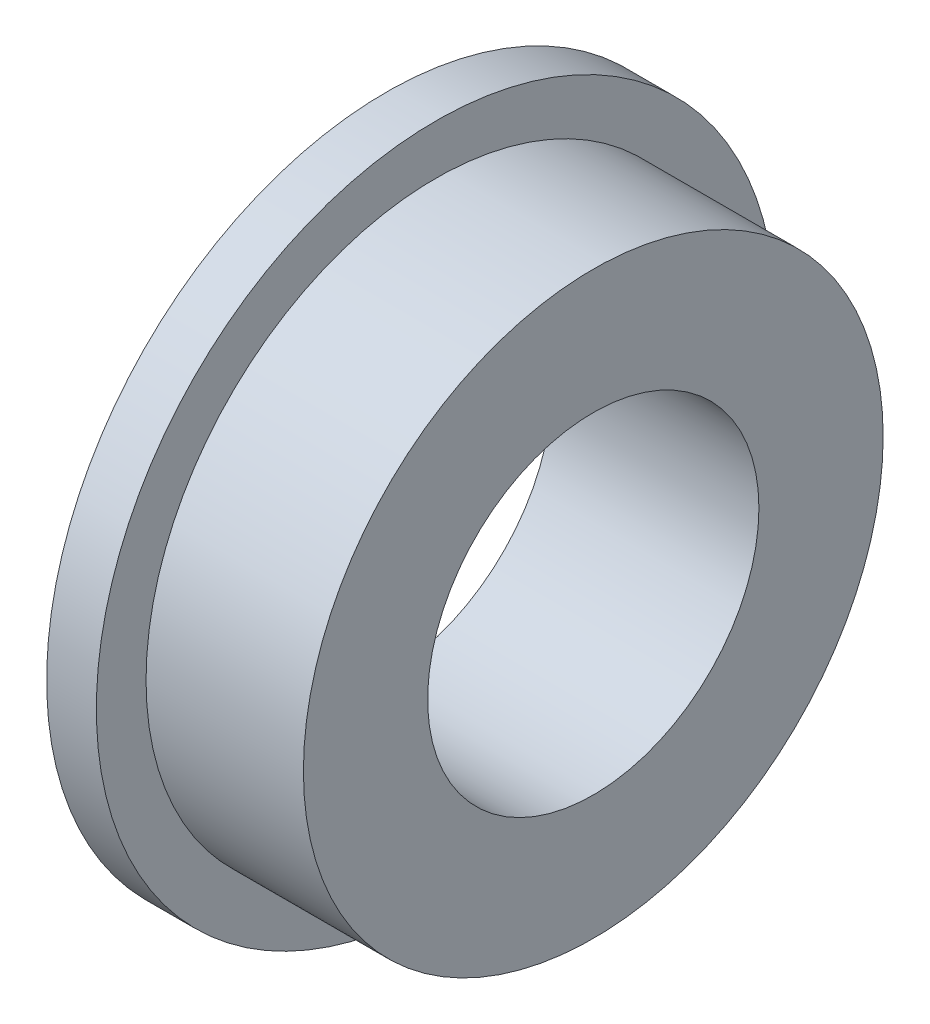
ISO-10303-21;
HEADER;
FILE_DESCRIPTION(('STEP AP214'),'2;1');
FILE_NAME('part.step','',(''),(''),'','','');
FILE_SCHEMA(('AUTOMOTIVE_DESIGN { 1 0 10303 214 1 1 1 1 }'));
ENDSEC;
DATA;
#1=APPLICATION_CONTEXT('core data for automotive mechanical design processes');
#2=APPLICATION_PROTOCOL_DEFINITION('international standard','automotive_design',2000,#1);
#3=PRODUCT_CONTEXT('',#1,'mechanical');
#4=PRODUCT('Part','Part','',(#3));
#5=PRODUCT_RELATED_PRODUCT_CATEGORY('part','',(#4));
#6=PRODUCT_DEFINITION_FORMATION('','',#4);
#7=PRODUCT_DEFINITION_CONTEXT('part definition',#1,'design');
#8=PRODUCT_DEFINITION('design','',#6,#7);
#9=PRODUCT_DEFINITION_SHAPE('','',#8);
#10=(LENGTH_UNIT() NAMED_UNIT(*) SI_UNIT(.MILLI.,.METRE.));
#11=(NAMED_UNIT(*) PLANE_ANGLE_UNIT() SI_UNIT($,.RADIAN.));
#12=(NAMED_UNIT(*) SI_UNIT($,.STERADIAN.) SOLID_ANGLE_UNIT());
#13=UNCERTAINTY_MEASURE_WITH_UNIT(LENGTH_MEASURE(1.E-05),#10,'distance_accuracy_value','');
#14=(GEOMETRIC_REPRESENTATION_CONTEXT(3) GLOBAL_UNCERTAINTY_ASSIGNED_CONTEXT((#13)) GLOBAL_UNIT_ASSIGNED_CONTEXT((#10,
#11,#12)) REPRESENTATION_CONTEXT('',''));
#15=CARTESIAN_POINT('',(0.,0.,0.));
#16=DIRECTION('',(0.,0.,1.));
#17=DIRECTION('',(1.,0.,0.));
#18=AXIS2_PLACEMENT_3D('',#15,#16,#17);
#19=CARTESIAN_POINT('',(2.5,0.,0.));
#20=DIRECTION('',(1.,0.,0.));
#21=DIRECTION('',(0.,0.,-1.));
#22=AXIS2_PLACEMENT_3D('',#19,#20,#21);
#23=PLANE('',#22);
#24=CARTESIAN_POINT('',(2.5,0.,0.));
#25=DIRECTION('',(1.,0.,0.));
#26=DIRECTION('',(0.,0.,-1.));
#27=AXIS2_PLACEMENT_3D('',#24,#25,#26);
#28=CIRCLE('',#27,2.);
#29=CARTESIAN_POINT('',(2.5,0.,-2.));
#30=VERTEX_POINT('',#29);
#31=EDGE_CURVE('E48',#30,#30,#28,.T.);
#32=ORIENTED_EDGE('',*,*,#31,.F.);
#33=EDGE_LOOP('',(#32));
#34=FACE_BOUND('',#33,.T.);
#35=CARTESIAN_POINT('',(2.5,0.,0.));
#36=DIRECTION('',(1.,0.,0.));
#37=DIRECTION('',(0.,0.,-1.));
#38=AXIS2_PLACEMENT_3D('',#35,#36,#37);
#39=CIRCLE('',#38,3.5);
#40=CARTESIAN_POINT('',(2.5,0.,-3.5));
#41=VERTEX_POINT('',#40);
#42=EDGE_CURVE('E57',#41,#41,#39,.T.);
#43=ORIENTED_EDGE('',*,*,#42,.T.);
#44=EDGE_LOOP('',(#43));
#45=FACE_BOUND('',#44,.T.);
#46=ADVANCED_FACE('F40',(#34,#45),#23,.T.);
#47=CARTESIAN_POINT('',(2.5,0.,0.));
#48=DIRECTION('',(-1.,0.,0.));
#49=DIRECTION('',(0.,0.,1.));
#50=AXIS2_PLACEMENT_3D('',#47,#48,#49);
#51=CYLINDRICAL_SURFACE('',#50,4.1);
#52=CARTESIAN_POINT('',(0.,0.,0.));
#53=DIRECTION('',(1.,0.,0.));
#54=DIRECTION('',(0.,0.,-1.));
#55=AXIS2_PLACEMENT_3D('',#52,#53,#54);
#56=CIRCLE('',#55,4.1);
#57=CARTESIAN_POINT('',(0.,0.,-4.1));
#58=VERTEX_POINT('',#57);
#59=EDGE_CURVE('E11',#58,#58,#56,.T.);
#60=ORIENTED_EDGE('',*,*,#59,.T.);
#61=EDGE_LOOP('',(#60));
#62=FACE_BOUND('',#61,.T.);
#63=CARTESIAN_POINT('',(0.6,0.,0.));
#64=DIRECTION('',(1.,0.,0.));
#65=DIRECTION('',(0.,0.,-1.));
#66=AXIS2_PLACEMENT_3D('',#63,#64,#65);
#67=CIRCLE('',#66,4.1);
#68=CARTESIAN_POINT('',(0.6,0.,-4.1));
#69=VERTEX_POINT('',#68);
#70=EDGE_CURVE('E44',#69,#69,#67,.T.);
#71=ORIENTED_EDGE('',*,*,#70,.F.);
#72=EDGE_LOOP('',(#71));
#73=FACE_BOUND('',#72,.T.);
#74=ADVANCED_FACE('F42',(#62,#73),#51,.T.);
#75=CARTESIAN_POINT('',(0.,0.,0.));
#76=DIRECTION('',(1.,0.,0.));
#77=DIRECTION('',(0.,0.,-1.));
#78=AXIS2_PLACEMENT_3D('',#75,#76,#77);
#79=PLANE('',#78);
#80=ORIENTED_EDGE('',*,*,#59,.F.);
#81=EDGE_LOOP('',(#80));
#82=FACE_BOUND('',#81,.T.);
#83=CARTESIAN_POINT('',(0.,0.,0.));
#84=DIRECTION('',(1.,0.,0.));
#85=DIRECTION('',(0.,0.,-1.));
#86=AXIS2_PLACEMENT_3D('',#83,#84,#85);
#87=CIRCLE('',#86,2.);
#88=CARTESIAN_POINT('',(0.,0.,-2.));
#89=VERTEX_POINT('',#88);
#90=EDGE_CURVE('E52',#89,#89,#87,.T.);
#91=ORIENTED_EDGE('',*,*,#90,.T.);
#92=EDGE_LOOP('',(#91));
#93=FACE_BOUND('',#92,.T.);
#94=ADVANCED_FACE('F70',(#82,#93),#79,.F.);
#95=CARTESIAN_POINT('',(2.5,0.,0.));
#96=DIRECTION('',(-1.,0.,0.));
#97=DIRECTION('',(0.,0.,1.));
#98=AXIS2_PLACEMENT_3D('',#95,#96,#97);
#99=CYLINDRICAL_SURFACE('',#98,2.);
#100=ORIENTED_EDGE('',*,*,#31,.T.);
#101=EDGE_LOOP('',(#100));
#102=FACE_BOUND('',#101,.T.);
#103=ORIENTED_EDGE('',*,*,#90,.F.);
#104=EDGE_LOOP('',(#103));
#105=FACE_BOUND('',#104,.T.);
#106=ADVANCED_FACE('F76',(#102,#105),#99,.F.);
#107=CARTESIAN_POINT('',(0.6,0.,0.));
#108=DIRECTION('',(1.,0.,0.));
#109=DIRECTION('',(0.,0.,-1.));
#110=AXIS2_PLACEMENT_3D('',#107,#108,#109);
#111=PLANE('',#110);
#112=CARTESIAN_POINT('',(0.6,0.,0.));
#113=DIRECTION('',(1.,0.,0.));
#114=DIRECTION('',(0.,0.,-1.));
#115=AXIS2_PLACEMENT_3D('',#112,#113,#114);
#116=CIRCLE('',#115,3.5);
#117=CARTESIAN_POINT('',(0.6,0.,-3.5));
#118=VERTEX_POINT('',#117);
#119=EDGE_CURVE('E60',#118,#118,#116,.T.);
#120=ORIENTED_EDGE('',*,*,#119,.F.);
#121=EDGE_LOOP('',(#120));
#122=FACE_BOUND('',#121,.T.);
#123=ORIENTED_EDGE('',*,*,#70,.T.);
#124=EDGE_LOOP('',(#123));
#125=FACE_BOUND('',#124,.T.);
#126=ADVANCED_FACE('F67',(#122,#125),#111,.T.);
#127=CARTESIAN_POINT('',(0.6,0.,0.));
#128=DIRECTION('',(1.,0.,0.));
#129=DIRECTION('',(0.,0.,-1.));
#130=AXIS2_PLACEMENT_3D('',#127,#128,#129);
#131=CYLINDRICAL_SURFACE('',#130,3.5);
#132=CARTESIAN_POINT('',(0.6,0.,-3.5));
#133=CARTESIAN_POINT('',(0.619791666666667,0.,-3.5));
#134=CARTESIAN_POINT('',(0.639583333333333,0.,-3.5));
#135=CARTESIAN_POINT('',(0.679166666666667,0.,-3.5));
#136=CARTESIAN_POINT('',(0.698958333333333,0.,-3.5));
#137=CARTESIAN_POINT('',(0.738541666666667,0.,-3.5));
#138=CARTESIAN_POINT('',(0.758333333333333,0.,-3.5));
#139=CARTESIAN_POINT('',(0.797916666666667,0.,-3.5));
#140=CARTESIAN_POINT('',(0.817708333333333,0.,-3.5));
#141=CARTESIAN_POINT('',(0.857291666666667,0.,-3.5));
#142=CARTESIAN_POINT('',(0.877083333333333,0.,-3.5));
#143=CARTESIAN_POINT('',(0.916666666666667,0.,-3.5));
#144=CARTESIAN_POINT('',(0.936458333333333,0.,-3.5));
#145=CARTESIAN_POINT('',(0.976041666666667,0.,-3.5));
#146=CARTESIAN_POINT('',(0.995833333333333,0.,-3.5));
#147=CARTESIAN_POINT('',(1.03541666666667,0.,-3.5));
#148=CARTESIAN_POINT('',(1.05520833333333,0.,-3.5));
#149=CARTESIAN_POINT('',(1.09479166666667,0.,-3.5));
#150=CARTESIAN_POINT('',(1.11458333333333,0.,-3.5));
#151=CARTESIAN_POINT('',(1.15416666666667,0.,-3.5));
#152=CARTESIAN_POINT('',(1.17395833333333,0.,-3.5));
#153=CARTESIAN_POINT('',(1.21354166666667,0.,-3.5));
#154=CARTESIAN_POINT('',(1.23333333333333,0.,-3.5));
#155=CARTESIAN_POINT('',(1.27291666666667,0.,-3.5));
#156=CARTESIAN_POINT('',(1.29270833333333,0.,-3.5));
#157=CARTESIAN_POINT('',(1.33229166666667,0.,-3.5));
#158=CARTESIAN_POINT('',(1.35208333333333,0.,-3.5));
#159=CARTESIAN_POINT('',(1.39166666666667,0.,-3.5));
#160=CARTESIAN_POINT('',(1.41145833333333,0.,-3.5));
#161=CARTESIAN_POINT('',(1.45104166666667,0.,-3.5));
#162=CARTESIAN_POINT('',(1.47083333333333,0.,-3.5));
#163=CARTESIAN_POINT('',(1.51041666666667,0.,-3.5));
#164=CARTESIAN_POINT('',(1.53020833333333,0.,-3.5));
#165=CARTESIAN_POINT('',(1.56979166666667,0.,-3.5));
#166=CARTESIAN_POINT('',(1.58958333333333,0.,-3.5));
#167=CARTESIAN_POINT('',(1.62916666666667,0.,-3.5));
#168=CARTESIAN_POINT('',(1.64895833333333,0.,-3.5));
#169=CARTESIAN_POINT('',(1.68854166666667,0.,-3.5));
#170=CARTESIAN_POINT('',(1.70833333333333,0.,-3.5));
#171=CARTESIAN_POINT('',(1.74791666666667,0.,-3.5));
#172=CARTESIAN_POINT('',(1.76770833333333,0.,-3.5));
#173=CARTESIAN_POINT('',(1.80729166666667,0.,-3.5));
#174=CARTESIAN_POINT('',(1.82708333333333,0.,-3.5));
#175=CARTESIAN_POINT('',(1.86666666666667,0.,-3.5));
#176=CARTESIAN_POINT('',(1.88645833333333,0.,-3.5));
#177=CARTESIAN_POINT('',(1.92604166666667,0.,-3.5));
#178=CARTESIAN_POINT('',(1.94583333333333,0.,-3.5));
#179=CARTESIAN_POINT('',(1.98541666666667,0.,-3.5));
#180=CARTESIAN_POINT('',(2.00520833333333,0.,-3.5));
#181=CARTESIAN_POINT('',(2.04479166666667,0.,-3.5));
#182=CARTESIAN_POINT('',(2.06458333333333,0.,-3.5));
#183=CARTESIAN_POINT('',(2.10416666666667,0.,-3.5));
#184=CARTESIAN_POINT('',(2.12395833333333,0.,-3.5));
#185=CARTESIAN_POINT('',(2.16354166666667,0.,-3.5));
#186=CARTESIAN_POINT('',(2.18333333333333,0.,-3.5));
#187=CARTESIAN_POINT('',(2.22291666666667,0.,-3.5));
#188=CARTESIAN_POINT('',(2.24270833333333,0.,-3.5));
#189=CARTESIAN_POINT('',(2.28229166666667,0.,-3.5));
#190=CARTESIAN_POINT('',(2.30208333333333,0.,-3.5));
#191=CARTESIAN_POINT('',(2.34166666666667,0.,-3.5));
#192=CARTESIAN_POINT('',(2.36145833333333,0.,-3.5));
#193=CARTESIAN_POINT('',(2.40104166666667,0.,-3.5));
#194=CARTESIAN_POINT('',(2.42083333333333,0.,-3.5));
#195=CARTESIAN_POINT('',(2.46041666666667,0.,-3.5));
#196=CARTESIAN_POINT('',(2.48020833333333,0.,-3.5));
#197=CARTESIAN_POINT('',(2.5,0.,-3.5));
#198=B_SPLINE_CURVE_WITH_KNOTS('',3,(#132,#133,#134,#135,#136,#137,#138,#139,#140,#141,#142,
#143,#144,#145,#146,#147,#148,#149,#150,#151,#152,#153,#154,#155,#156,#157,#158,#159,#160,#161,
#162,#163,#164,#165,#166,#167,#168,#169,#170,#171,#172,#173,#174,#175,#176,#177,#178,#179,#180,
#181,#182,#183,#184,#185,#186,#187,#188,#189,#190,#191,#192,#193,#194,#195,#196,#197),
.UNSPECIFIED.,.F.,.F.,(4,2,2,2,2,2,2,2,2,2,2,2,2,2,2,2,2,2,2,2,2,2,2,2,2,2,2,2,2,2,2,2,4),(0.,
0.0593750000000001,0.11875,0.178125,0.2375,0.296875,0.35625,0.415625,0.475,0.534375,0.59375,
0.653125,0.7125,0.771875,0.83125,0.890625,0.95,1.009375,1.06875,1.128125,1.1875,1.246875,
1.30625,1.365625,1.425,1.484375,1.54375,1.603125,1.6625,1.721875,1.78125,1.840625,1.9),.UNSPECIFIED.);
#199=EDGE_CURVE('BSEAM89',#118,#41,#198,.T.);
#200=ORIENTED_EDGE('',*,*,#119,.T.);
#201=ORIENTED_EDGE('',*,*,#42,.F.);
#202=ORIENTED_EDGE('',*,*,#199,.T.);
#203=ORIENTED_EDGE('',*,*,#199,.F.);
#204=EDGE_LOOP('',(#200,#202,#201,#203));
#205=FACE_BOUND('',#204,.T.);
#206=ADVANCED_FACE('F89',(#205),#131,.T.);
#207=CLOSED_SHELL('',(#46,#74,#94,#106,#126,#206));
#208=MANIFOLD_SOLID_BREP('B2',#207);
#209=ADVANCED_BREP_SHAPE_REPRESENTATION('',(#18,#208),#14);
#210=SHAPE_DEFINITION_REPRESENTATION(#9,#209);
ENDSEC;
END-ISO-10303-21;
